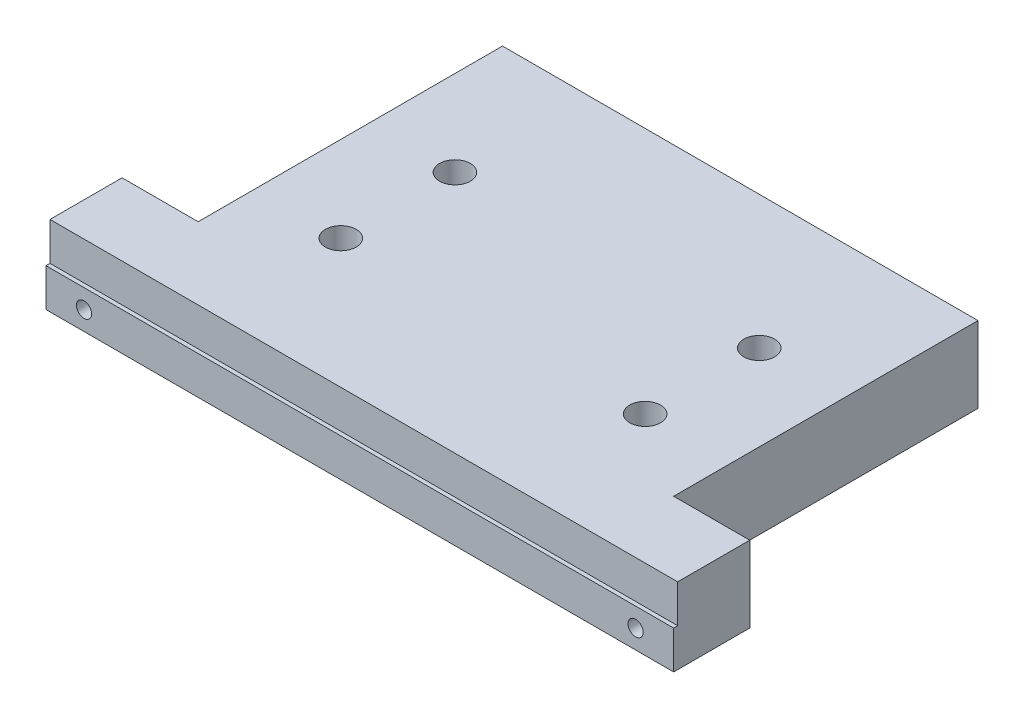
ISO-10303-21;
HEADER;
FILE_DESCRIPTION(('STEP AP214'),'2;1');
FILE_NAME('part.step','',(''),(''),'','','');
FILE_SCHEMA(('AUTOMOTIVE_DESIGN { 1 0 10303 214 1 1 1 1 }'));
ENDSEC;
DATA;
#1=APPLICATION_CONTEXT('core data for automotive mechanical design processes');
#2=APPLICATION_PROTOCOL_DEFINITION('international standard','automotive_design',2000,#1);
#3=PRODUCT_CONTEXT('',#1,'mechanical');
#4=PRODUCT('Part','Part','',(#3));
#5=PRODUCT_RELATED_PRODUCT_CATEGORY('part','',(#4));
#6=PRODUCT_DEFINITION_FORMATION('','',#4);
#7=PRODUCT_DEFINITION_CONTEXT('part definition',#1,'design');
#8=PRODUCT_DEFINITION('design','',#6,#7);
#9=PRODUCT_DEFINITION_SHAPE('','',#8);
#10=(LENGTH_UNIT() NAMED_UNIT(*) SI_UNIT(.MILLI.,.METRE.));
#11=(NAMED_UNIT(*) PLANE_ANGLE_UNIT() SI_UNIT($,.RADIAN.));
#12=(NAMED_UNIT(*) SI_UNIT($,.STERADIAN.) SOLID_ANGLE_UNIT());
#13=UNCERTAINTY_MEASURE_WITH_UNIT(LENGTH_MEASURE(1.E-05),#10,'distance_accuracy_value','');
#14=(GEOMETRIC_REPRESENTATION_CONTEXT(3) GLOBAL_UNCERTAINTY_ASSIGNED_CONTEXT((#13)) GLOBAL_UNIT_ASSIGNED_CONTEXT((#10,
#11,#12)) REPRESENTATION_CONTEXT('',''));
#15=CARTESIAN_POINT('',(0.,0.,0.));
#16=DIRECTION('',(0.,0.,1.));
#17=DIRECTION('',(1.,0.,0.));
#18=AXIS2_PLACEMENT_3D('',#15,#16,#17);
#19=CARTESIAN_POINT('',(125.,0.,100.));
#20=DIRECTION('',(-1.,0.,0.));
#21=DIRECTION('',(0.,0.,1.));
#22=AXIS2_PLACEMENT_3D('',#19,#20,#21);
#23=PLANE('',#22);
#24=DIRECTION('',(0.,1.,0.));
#25=VECTOR('',#24,1.);
#26=CARTESIAN_POINT('',(125.,20.,80.));
#27=LINE('',#26,#25);
#28=CARTESIAN_POINT('',(125.,0.,80.));
#29=VERTEX_POINT('',#28);
#30=CARTESIAN_POINT('',(125.,20.,80.));
#31=VERTEX_POINT('',#30);
#32=EDGE_CURVE('E60',#29,#31,#27,.T.);
#33=ORIENTED_EDGE('',*,*,#32,.F.);
#34=DIRECTION('',(0.,0.,-1.));
#35=VECTOR('',#34,1.);
#36=CARTESIAN_POINT('',(125.,0.,100.));
#37=LINE('',#36,#35);
#38=CARTESIAN_POINT('',(125.,0.,0.));
#39=VERTEX_POINT('',#38);
#40=EDGE_CURVE('E45',#29,#39,#37,.T.);
#41=ORIENTED_EDGE('',*,*,#40,.T.);
#42=DIRECTION('',(0.,1.,0.));
#43=VECTOR('',#42,1.);
#44=CARTESIAN_POINT('',(125.,0.,0.));
#45=LINE('',#44,#43);
#46=CARTESIAN_POINT('',(125.,20.,0.));
#47=VERTEX_POINT('',#46);
#48=EDGE_CURVE('E161',#39,#47,#45,.T.);
#49=ORIENTED_EDGE('',*,*,#48,.T.);
#50=DIRECTION('',(0.,0.,-1.));
#51=VECTOR('',#50,1.);
#52=CARTESIAN_POINT('',(125.,20.,100.));
#53=LINE('',#52,#51);
#54=EDGE_CURVE('E167',#31,#47,#53,.T.);
#55=ORIENTED_EDGE('',*,*,#54,.F.);
#56=EDGE_LOOP('',(#33,#41,#49,#55));
#57=FACE_BOUND('',#56,.T.);
#58=ADVANCED_FACE('F37',(#57),#23,.F.);
#59=CARTESIAN_POINT('',(0.,0.,100.));
#60=DIRECTION('',(1.,0.,0.));
#61=DIRECTION('',(0.,1.,0.));
#62=AXIS2_PLACEMENT_3D('',#59,#60,#61);
#63=PLANE('',#62);
#64=DIRECTION('',(0.,-1.,0.));
#65=VECTOR('',#64,1.);
#66=CARTESIAN_POINT('',(0.,20.,80.));
#67=LINE('',#66,#65);
#68=CARTESIAN_POINT('',(0.,20.,80.));
#69=VERTEX_POINT('',#68);
#70=CARTESIAN_POINT('',(0.,0.,80.));
#71=VERTEX_POINT('',#70);
#72=EDGE_CURVE('E142',#69,#71,#67,.T.);
#73=ORIENTED_EDGE('',*,*,#72,.F.);
#74=DIRECTION('',(0.,0.,-1.));
#75=VECTOR('',#74,1.);
#76=CARTESIAN_POINT('',(0.,20.,100.));
#77=LINE('',#76,#75);
#78=CARTESIAN_POINT('',(0.,20.,0.));
#79=VERTEX_POINT('',#78);
#80=EDGE_CURVE('E154',#69,#79,#77,.T.);
#81=ORIENTED_EDGE('',*,*,#80,.T.);
#82=DIRECTION('',(0.,-1.,0.));
#83=VECTOR('',#82,1.);
#84=CARTESIAN_POINT('',(0.,0.,0.));
#85=LINE('',#84,#83);
#86=CARTESIAN_POINT('',(0.,0.,0.));
#87=VERTEX_POINT('',#86);
#88=EDGE_CURVE('E151',#79,#87,#85,.T.);
#89=ORIENTED_EDGE('',*,*,#88,.T.);
#90=DIRECTION('',(0.,0.,-1.));
#91=VECTOR('',#90,1.);
#92=CARTESIAN_POINT('',(0.,0.,100.));
#93=LINE('',#92,#91);
#94=EDGE_CURVE('E11',#71,#87,#93,.T.);
#95=ORIENTED_EDGE('',*,*,#94,.F.);
#96=EDGE_LOOP('',(#73,#81,#89,#95));
#97=FACE_BOUND('',#96,.T.);
#98=ADVANCED_FACE('F39',(#97),#63,.F.);
#99=CARTESIAN_POINT('',(0.,0.,100.));
#100=DIRECTION('',(0.,1.,0.));
#101=DIRECTION('',(0.,0.,1.));
#102=AXIS2_PLACEMENT_3D('',#99,#100,#101);
#103=PLANE('',#102);
#104=CARTESIAN_POINT('',(102.5,0.,35.0000000000001));
#105=DIRECTION('',(0.,1.,0.));
#106=DIRECTION('',(0.,0.,1.));
#107=AXIS2_PLACEMENT_3D('',#104,#105,#106);
#108=CIRCLE('',#107,4.05);
#109=CARTESIAN_POINT('',(102.5,0.,39.0500000000001));
#110=VERTEX_POINT('',#109);
#111=EDGE_CURVE('E145',#110,#110,#108,.T.);
#112=ORIENTED_EDGE('',*,*,#111,.T.);
#113=EDGE_LOOP('',(#112));
#114=FACE_BOUND('',#113,.T.);
#115=CARTESIAN_POINT('',(102.5,0.,65.));
#116=DIRECTION('',(0.,1.,0.));
#117=DIRECTION('',(0.,0.,1.));
#118=AXIS2_PLACEMENT_3D('',#115,#116,#117);
#119=CIRCLE('',#118,4.05);
#120=CARTESIAN_POINT('',(102.5,0.,69.05));
#121=VERTEX_POINT('',#120);
#122=EDGE_CURVE('E222',#121,#121,#119,.T.);
#123=ORIENTED_EDGE('',*,*,#122,.T.);
#124=EDGE_LOOP('',(#123));
#125=FACE_BOUND('',#124,.T.);
#126=CARTESIAN_POINT('',(22.5,0.,65.));
#127=DIRECTION('',(0.,1.,0.));
#128=DIRECTION('',(0.,0.,1.));
#129=AXIS2_PLACEMENT_3D('',#126,#127,#128);
#130=CIRCLE('',#129,4.05);
#131=CARTESIAN_POINT('',(22.5,0.,69.05));
#132=VERTEX_POINT('',#131);
#133=EDGE_CURVE('E219',#132,#132,#130,.T.);
#134=ORIENTED_EDGE('',*,*,#133,.T.);
#135=EDGE_LOOP('',(#134));
#136=FACE_BOUND('',#135,.T.);
#137=CARTESIAN_POINT('',(22.5,0.,35.));
#138=DIRECTION('',(0.,1.,0.));
#139=DIRECTION('',(0.,0.,1.));
#140=AXIS2_PLACEMENT_3D('',#137,#138,#139);
#141=CIRCLE('',#140,4.05);
#142=CARTESIAN_POINT('',(22.5,0.,39.05));
#143=VERTEX_POINT('',#142);
#144=EDGE_CURVE('E216',#143,#143,#141,.T.);
#145=ORIENTED_EDGE('',*,*,#144,.T.);
#146=EDGE_LOOP('',(#145));
#147=FACE_BOUND('',#146,.T.);
#148=DIRECTION('',(1.,0.,0.));
#149=VECTOR('',#148,1.);
#150=CARTESIAN_POINT('',(0.,0.,0.));
#151=LINE('',#150,#149);
#152=EDGE_CURVE('E158',#87,#39,#151,.T.);
#153=ORIENTED_EDGE('',*,*,#152,.T.);
#154=ORIENTED_EDGE('',*,*,#40,.F.);
#155=DIRECTION('',(-1.,0.,0.));
#156=VECTOR('',#155,1.);
#157=CARTESIAN_POINT('',(145.,0.,80.));
#158=LINE('',#157,#156);
#159=CARTESIAN_POINT('',(145.,0.,80.));
#160=VERTEX_POINT('',#159);
#161=EDGE_CURVE('E190',#160,#29,#158,.T.);
#162=ORIENTED_EDGE('',*,*,#161,.F.);
#163=DIRECTION('',(0.,0.,-1.));
#164=VECTOR('',#163,1.);
#165=CARTESIAN_POINT('',(145.,0.,100.));
#166=LINE('',#165,#164);
#167=CARTESIAN_POINT('',(145.,0.,100.));
#168=VERTEX_POINT('',#167);
#169=EDGE_CURVE('E193',#168,#160,#166,.T.);
#170=ORIENTED_EDGE('',*,*,#169,.F.);
#171=DIRECTION('',(1.,0.,0.));
#172=VECTOR('',#171,1.);
#173=CARTESIAN_POINT('',(0.,0.,100.));
#174=LINE('',#173,#172);
#175=CARTESIAN_POINT('',(-20.,0.,100.));
#176=VERTEX_POINT('',#175);
#177=EDGE_CURVE('E152',#176,#168,#174,.T.);
#178=ORIENTED_EDGE('',*,*,#177,.F.);
#179=DIRECTION('',(0.,0.,1.));
#180=VECTOR('',#179,1.);
#181=CARTESIAN_POINT('',(-20.,0.,80.));
#182=LINE('',#181,#180);
#183=CARTESIAN_POINT('',(-20.,0.,80.));
#184=VERTEX_POINT('',#183);
#185=EDGE_CURVE('E133',#184,#176,#182,.T.);
#186=ORIENTED_EDGE('',*,*,#185,.F.);
#187=DIRECTION('',(1.,0.,0.));
#188=VECTOR('',#187,1.);
#189=CARTESIAN_POINT('',(-20.,0.,80.));
#190=LINE('',#189,#188);
#191=EDGE_CURVE('E148',#184,#71,#190,.T.);
#192=ORIENTED_EDGE('',*,*,#191,.T.);
#193=ORIENTED_EDGE('',*,*,#94,.T.);
#194=EDGE_LOOP('',(#153,#154,#162,#170,#178,#186,#192,#193));
#195=FACE_BOUND('',#194,.T.);
#196=ADVANCED_FACE('F174',(#114,#125,#136,#147,#195),#103,.F.);
#197=CARTESIAN_POINT('',(0.,20.,100.));
#198=DIRECTION('',(0.,-1.,0.));
#199=DIRECTION('',(0.,0.,-1.));
#200=AXIS2_PLACEMENT_3D('',#197,#198,#199);
#201=PLANE('',#200);
#202=CARTESIAN_POINT('',(102.5,20.,35.0000000000001));
#203=DIRECTION('',(0.,1.,0.));
#204=DIRECTION('',(0.,0.,-1.));
#205=AXIS2_PLACEMENT_3D('',#202,#203,#204);
#206=CIRCLE('',#205,4.05);
#207=CARTESIAN_POINT('',(102.5,20.,30.9500000000001));
#208=VERTEX_POINT('',#207);
#209=EDGE_CURVE('E204',#208,#208,#206,.T.);
#210=ORIENTED_EDGE('',*,*,#209,.F.);
#211=EDGE_LOOP('',(#210));
#212=FACE_BOUND('',#211,.T.);
#213=CARTESIAN_POINT('',(102.5,20.,65.));
#214=DIRECTION('',(0.,1.,0.));
#215=DIRECTION('',(0.,0.,-1.));
#216=AXIS2_PLACEMENT_3D('',#213,#214,#215);
#217=CIRCLE('',#216,4.05);
#218=CARTESIAN_POINT('',(102.5,20.,60.95));
#219=VERTEX_POINT('',#218);
#220=EDGE_CURVE('E209',#219,#219,#217,.T.);
#221=ORIENTED_EDGE('',*,*,#220,.F.);
#222=EDGE_LOOP('',(#221));
#223=FACE_BOUND('',#222,.T.);
#224=CARTESIAN_POINT('',(22.5,20.,65.));
#225=DIRECTION('',(0.,1.,0.));
#226=DIRECTION('',(0.,0.,1.));
#227=AXIS2_PLACEMENT_3D('',#224,#225,#226);
#228=CIRCLE('',#227,4.05);
#229=CARTESIAN_POINT('',(22.5,20.,69.05));
#230=VERTEX_POINT('',#229);
#231=EDGE_CURVE('E205',#230,#230,#228,.T.);
#232=ORIENTED_EDGE('',*,*,#231,.F.);
#233=EDGE_LOOP('',(#232));
#234=FACE_BOUND('',#233,.T.);
#235=CARTESIAN_POINT('',(22.5,20.,35.));
#236=DIRECTION('',(0.,1.,0.));
#237=DIRECTION('',(0.,0.,1.));
#238=AXIS2_PLACEMENT_3D('',#235,#236,#237);
#239=CIRCLE('',#238,4.05);
#240=CARTESIAN_POINT('',(22.5,20.,39.05));
#241=VERTEX_POINT('',#240);
#242=EDGE_CURVE('E208',#241,#241,#239,.T.);
#243=ORIENTED_EDGE('',*,*,#242,.F.);
#244=EDGE_LOOP('',(#243));
#245=FACE_BOUND('',#244,.T.);
#246=DIRECTION('',(0.,0.,-1.));
#247=VECTOR('',#246,1.);
#248=CARTESIAN_POINT('',(-20.,20.,80.));
#249=LINE('',#248,#247);
#250=CARTESIAN_POINT('',(-20.,20.,98.95));
#251=VERTEX_POINT('',#250);
#252=CARTESIAN_POINT('',(-20.,20.,80.));
#253=VERTEX_POINT('',#252);
#254=EDGE_CURVE('E134',#251,#253,#249,.T.);
#255=ORIENTED_EDGE('',*,*,#254,.F.);
#256=DIRECTION('',(-1.,0.,0.));
#257=VECTOR('',#256,1.);
#258=CARTESIAN_POINT('',(-20.,20.,98.95));
#259=LINE('',#258,#257);
#260=CARTESIAN_POINT('',(145.,20.,98.95));
#261=VERTEX_POINT('',#260);
#262=EDGE_CURVE('E119',#261,#251,#259,.T.);
#263=ORIENTED_EDGE('',*,*,#262,.F.);
#264=DIRECTION('',(0.,0.,1.));
#265=VECTOR('',#264,1.);
#266=CARTESIAN_POINT('',(145.,20.,100.));
#267=LINE('',#266,#265);
#268=CARTESIAN_POINT('',(145.,20.,80.));
#269=VERTEX_POINT('',#268);
#270=EDGE_CURVE('E200',#269,#261,#267,.T.);
#271=ORIENTED_EDGE('',*,*,#270,.F.);
#272=DIRECTION('',(-1.,0.,0.));
#273=VECTOR('',#272,1.);
#274=CARTESIAN_POINT('',(145.,20.,80.));
#275=LINE('',#274,#273);
#276=EDGE_CURVE('E186',#269,#31,#275,.T.);
#277=ORIENTED_EDGE('',*,*,#276,.T.);
#278=ORIENTED_EDGE('',*,*,#54,.T.);
#279=DIRECTION('',(-1.,0.,0.));
#280=VECTOR('',#279,1.);
#281=CARTESIAN_POINT('',(0.,20.,0.));
#282=LINE('',#281,#280);
#283=EDGE_CURVE('E155',#47,#79,#282,.T.);
#284=ORIENTED_EDGE('',*,*,#283,.T.);
#285=ORIENTED_EDGE('',*,*,#80,.F.);
#286=DIRECTION('',(1.,0.,0.));
#287=VECTOR('',#286,1.);
#288=CARTESIAN_POINT('',(-20.,20.,80.));
#289=LINE('',#288,#287);
#290=EDGE_CURVE('E136',#253,#69,#289,.T.);
#291=ORIENTED_EDGE('',*,*,#290,.F.);
#292=EDGE_LOOP('',(#255,#263,#271,#277,#278,#284,#285,#291));
#293=FACE_BOUND('',#292,.T.);
#294=ADVANCED_FACE('F181',(#212,#223,#234,#245,#293),#201,.F.);
#295=CARTESIAN_POINT('',(0.,0.,100.));
#296=DIRECTION('',(0.,0.,-1.));
#297=DIRECTION('',(-1.,0.,0.));
#298=AXIS2_PLACEMENT_3D('',#295,#296,#297);
#299=PLANE('',#298);
#300=CARTESIAN_POINT('',(-10.,4.99999999999983,100.));
#301=DIRECTION('',(0.,0.,-1.));
#302=DIRECTION('',(-1.,0.,0.));
#303=AXIS2_PLACEMENT_3D('',#300,#301,#302);
#304=CIRCLE('',#303,2.);
#305=CARTESIAN_POINT('',(-12.,4.99999999999983,100.));
#306=VERTEX_POINT('',#305);
#307=EDGE_CURVE('E191',#306,#306,#304,.T.);
#308=ORIENTED_EDGE('',*,*,#307,.T.);
#309=EDGE_LOOP('',(#308));
#310=FACE_BOUND('',#309,.T.);
#311=CARTESIAN_POINT('',(135.,4.99999999999981,100.));
#312=DIRECTION('',(0.,0.,-1.));
#313=DIRECTION('',(1.,0.,0.));
#314=AXIS2_PLACEMENT_3D('',#311,#312,#313);
#315=CIRCLE('',#314,2.00000000000003);
#316=CARTESIAN_POINT('',(137.,4.99999999999981,100.));
#317=VERTEX_POINT('',#316);
#318=EDGE_CURVE('E235',#317,#317,#315,.T.);
#319=ORIENTED_EDGE('',*,*,#318,.T.);
#320=EDGE_LOOP('',(#319));
#321=FACE_BOUND('',#320,.T.);
#322=DIRECTION('',(0.,-1.,0.));
#323=VECTOR('',#322,1.);
#324=CARTESIAN_POINT('',(145.,20.,100.));
#325=LINE('',#324,#323);
#326=CARTESIAN_POINT('',(145.,10.,100.));
#327=VERTEX_POINT('',#326);
#328=EDGE_CURVE('E127',#327,#168,#325,.T.);
#329=ORIENTED_EDGE('',*,*,#328,.F.);
#330=DIRECTION('',(1.,0.,0.));
#331=VECTOR('',#330,1.);
#332=CARTESIAN_POINT('',(-20.,10.,100.));
#333=LINE('',#332,#331);
#334=CARTESIAN_POINT('',(-20.,10.,100.));
#335=VERTEX_POINT('',#334);
#336=EDGE_CURVE('E52',#335,#327,#333,.T.);
#337=ORIENTED_EDGE('',*,*,#336,.F.);
#338=DIRECTION('',(0.,1.,0.));
#339=VECTOR('',#338,1.);
#340=CARTESIAN_POINT('',(-20.,20.,100.));
#341=LINE('',#340,#339);
#342=EDGE_CURVE('E126',#176,#335,#341,.T.);
#343=ORIENTED_EDGE('',*,*,#342,.F.);
#344=ORIENTED_EDGE('',*,*,#177,.T.);
#345=EDGE_LOOP('',(#329,#337,#343,#344));
#346=FACE_BOUND('',#345,.T.);
#347=ADVANCED_FACE('F124',(#310,#321,#346),#299,.F.);
#348=CARTESIAN_POINT('',(0.,0.,0.));
#349=DIRECTION('',(0.,0.,-1.));
#350=DIRECTION('',(-1.,0.,0.));
#351=AXIS2_PLACEMENT_3D('',#348,#349,#350);
#352=PLANE('',#351);
#353=ORIENTED_EDGE('',*,*,#88,.F.);
#354=ORIENTED_EDGE('',*,*,#283,.F.);
#355=ORIENTED_EDGE('',*,*,#48,.F.);
#356=ORIENTED_EDGE('',*,*,#152,.F.);
#357=EDGE_LOOP('',(#353,#354,#355,#356));
#358=FACE_BOUND('',#357,.T.);
#359=ADVANCED_FACE('F177',(#358),#352,.T.);
#360=CARTESIAN_POINT('',(-20.,20.,80.));
#361=DIRECTION('',(0.,0.,1.));
#362=DIRECTION('',(0.,-1.,0.));
#363=AXIS2_PLACEMENT_3D('',#360,#361,#362);
#364=PLANE('',#363);
#365=CARTESIAN_POINT('',(-10.,4.99999999999983,80.));
#366=DIRECTION('',(0.,0.,-1.));
#367=DIRECTION('',(-1.,0.,0.));
#368=AXIS2_PLACEMENT_3D('',#365,#366,#367);
#369=CIRCLE('',#368,2.);
#370=CARTESIAN_POINT('',(-12.,4.99999999999983,80.));
#371=VERTEX_POINT('',#370);
#372=EDGE_CURVE('E196',#371,#371,#369,.T.);
#373=ORIENTED_EDGE('',*,*,#372,.F.);
#374=EDGE_LOOP('',(#373));
#375=FACE_BOUND('',#374,.T.);
#376=ORIENTED_EDGE('',*,*,#72,.T.);
#377=ORIENTED_EDGE('',*,*,#191,.F.);
#378=DIRECTION('',(0.,-1.,0.));
#379=VECTOR('',#378,1.);
#380=CARTESIAN_POINT('',(-20.,20.,80.));
#381=LINE('',#380,#379);
#382=EDGE_CURVE('E138',#253,#184,#381,.T.);
#383=ORIENTED_EDGE('',*,*,#382,.F.);
#384=ORIENTED_EDGE('',*,*,#290,.T.);
#385=EDGE_LOOP('',(#376,#377,#383,#384));
#386=FACE_BOUND('',#385,.T.);
#387=ADVANCED_FACE('F229',(#375,#386),#364,.F.);
#388=CARTESIAN_POINT('',(-20.,0.,0.));
#389=DIRECTION('',(-1.,0.,0.));
#390=DIRECTION('',(0.,-1.,0.));
#391=AXIS2_PLACEMENT_3D('',#388,#389,#390);
#392=PLANE('',#391);
#393=DIRECTION('',(0.,1.,0.));
#394=VECTOR('',#393,1.);
#395=CARTESIAN_POINT('',(-20.,10.,98.95));
#396=LINE('',#395,#394);
#397=CARTESIAN_POINT('',(-20.,10.,98.95));
#398=VERTEX_POINT('',#397);
#399=EDGE_CURVE('E239',#398,#251,#396,.T.);
#400=ORIENTED_EDGE('',*,*,#399,.T.);
#401=ORIENTED_EDGE('',*,*,#254,.T.);
#402=ORIENTED_EDGE('',*,*,#382,.T.);
#403=ORIENTED_EDGE('',*,*,#185,.T.);
#404=ORIENTED_EDGE('',*,*,#342,.T.);
#405=DIRECTION('',(0.,0.,1.));
#406=VECTOR('',#405,1.);
#407=CARTESIAN_POINT('',(-20.,10.,100.));
#408=LINE('',#407,#406);
#409=EDGE_CURVE('E112',#398,#335,#408,.T.);
#410=ORIENTED_EDGE('',*,*,#409,.F.);
#411=EDGE_LOOP('',(#400,#401,#402,#403,#404,#410));
#412=FACE_BOUND('',#411,.T.);
#413=ADVANCED_FACE('F131',(#412),#392,.T.);
#414=CARTESIAN_POINT('',(22.5,-20.,35.));
#415=DIRECTION('',(0.,1.,0.));
#416=DIRECTION('',(0.,0.,1.));
#417=AXIS2_PLACEMENT_3D('',#414,#415,#416);
#418=CYLINDRICAL_SURFACE('',#417,4.05);
#419=ORIENTED_EDGE('',*,*,#242,.T.);
#420=EDGE_LOOP('',(#419));
#421=FACE_BOUND('',#420,.T.);
#422=ORIENTED_EDGE('',*,*,#144,.F.);
#423=EDGE_LOOP('',(#422));
#424=FACE_BOUND('',#423,.T.);
#425=ADVANCED_FACE('F290',(#421,#424),#418,.F.);
#426=CARTESIAN_POINT('',(22.5,-20.,65.));
#427=DIRECTION('',(0.,1.,0.));
#428=DIRECTION('',(0.,0.,1.));
#429=AXIS2_PLACEMENT_3D('',#426,#427,#428);
#430=CYLINDRICAL_SURFACE('',#429,4.05);
#431=ORIENTED_EDGE('',*,*,#231,.T.);
#432=EDGE_LOOP('',(#431));
#433=FACE_BOUND('',#432,.T.);
#434=ORIENTED_EDGE('',*,*,#133,.F.);
#435=EDGE_LOOP('',(#434));
#436=FACE_BOUND('',#435,.T.);
#437=ADVANCED_FACE('F292',(#433,#436),#430,.F.);
#438=CARTESIAN_POINT('',(102.5,-20.,65.));
#439=DIRECTION('',(0.,1.,0.));
#440=DIRECTION('',(0.,0.,1.));
#441=AXIS2_PLACEMENT_3D('',#438,#439,#440);
#442=CYLINDRICAL_SURFACE('',#441,4.05);
#443=ORIENTED_EDGE('',*,*,#220,.T.);
#444=EDGE_LOOP('',(#443));
#445=FACE_BOUND('',#444,.T.);
#446=ORIENTED_EDGE('',*,*,#122,.F.);
#447=EDGE_LOOP('',(#446));
#448=FACE_BOUND('',#447,.T.);
#449=ADVANCED_FACE('F299',(#445,#448),#442,.F.);
#450=CARTESIAN_POINT('',(102.5,-20.,35.0000000000001));
#451=DIRECTION('',(0.,1.,0.));
#452=DIRECTION('',(0.,0.,1.));
#453=AXIS2_PLACEMENT_3D('',#450,#451,#452);
#454=CYLINDRICAL_SURFACE('',#453,4.05);
#455=ORIENTED_EDGE('',*,*,#209,.T.);
#456=EDGE_LOOP('',(#455));
#457=FACE_BOUND('',#456,.T.);
#458=ORIENTED_EDGE('',*,*,#111,.F.);
#459=EDGE_LOOP('',(#458));
#460=FACE_BOUND('',#459,.T.);
#461=ADVANCED_FACE('F265',(#457,#460),#454,.F.);
#462=CARTESIAN_POINT('',(145.,20.,80.));
#463=DIRECTION('',(0.,0.,1.));
#464=DIRECTION('',(1.,0.,0.));
#465=AXIS2_PLACEMENT_3D('',#462,#463,#464);
#466=PLANE('',#465);
#467=CARTESIAN_POINT('',(135.,4.99999999999981,80.));
#468=DIRECTION('',(0.,0.,-1.));
#469=DIRECTION('',(1.,0.,0.));
#470=AXIS2_PLACEMENT_3D('',#467,#468,#469);
#471=CIRCLE('',#470,2.00000000000003);
#472=CARTESIAN_POINT('',(137.,4.99999999999981,80.));
#473=VERTEX_POINT('',#472);
#474=EDGE_CURVE('E238',#473,#473,#471,.T.);
#475=ORIENTED_EDGE('',*,*,#474,.F.);
#476=EDGE_LOOP('',(#475));
#477=FACE_BOUND('',#476,.T.);
#478=ORIENTED_EDGE('',*,*,#32,.T.);
#479=ORIENTED_EDGE('',*,*,#276,.F.);
#480=DIRECTION('',(0.,1.,0.));
#481=VECTOR('',#480,1.);
#482=CARTESIAN_POINT('',(145.,20.,80.));
#483=LINE('',#482,#481);
#484=EDGE_CURVE('E232',#160,#269,#483,.T.);
#485=ORIENTED_EDGE('',*,*,#484,.F.);
#486=ORIENTED_EDGE('',*,*,#161,.T.);
#487=EDGE_LOOP('',(#478,#479,#485,#486));
#488=FACE_BOUND('',#487,.T.);
#489=ADVANCED_FACE('F188',(#477,#488),#466,.F.);
#490=CARTESIAN_POINT('',(145.,0.,0.));
#491=DIRECTION('',(1.,0.,0.));
#492=DIRECTION('',(0.,0.,-1.));
#493=AXIS2_PLACEMENT_3D('',#490,#491,#492);
#494=PLANE('',#493);
#495=DIRECTION('',(0.,1.,0.));
#496=VECTOR('',#495,1.);
#497=CARTESIAN_POINT('',(145.,10.,98.95));
#498=LINE('',#497,#496);
#499=CARTESIAN_POINT('',(145.,10.,98.95));
#500=VERTEX_POINT('',#499);
#501=EDGE_CURVE('E244',#500,#261,#498,.T.);
#502=ORIENTED_EDGE('',*,*,#501,.F.);
#503=DIRECTION('',(0.,0.,-1.));
#504=VECTOR('',#503,1.);
#505=CARTESIAN_POINT('',(145.,10.,100.));
#506=LINE('',#505,#504);
#507=EDGE_CURVE('E128',#327,#500,#506,.T.);
#508=ORIENTED_EDGE('',*,*,#507,.F.);
#509=ORIENTED_EDGE('',*,*,#328,.T.);
#510=ORIENTED_EDGE('',*,*,#169,.T.);
#511=ORIENTED_EDGE('',*,*,#484,.T.);
#512=ORIENTED_EDGE('',*,*,#270,.T.);
#513=EDGE_LOOP('',(#502,#508,#509,#510,#511,#512));
#514=FACE_BOUND('',#513,.T.);
#515=ADVANCED_FACE('F254',(#514),#494,.T.);
#516=CARTESIAN_POINT('',(135.,4.99999999999981,100.));
#517=DIRECTION('',(0.,0.,-1.));
#518=DIRECTION('',(-1.,0.,0.));
#519=AXIS2_PLACEMENT_3D('',#516,#517,#518);
#520=CYLINDRICAL_SURFACE('',#519,2.00000000000003);
#521=ORIENTED_EDGE('',*,*,#318,.F.);
#522=EDGE_LOOP('',(#521));
#523=FACE_BOUND('',#522,.T.);
#524=ORIENTED_EDGE('',*,*,#474,.T.);
#525=EDGE_LOOP('',(#524));
#526=FACE_BOUND('',#525,.T.);
#527=ADVANCED_FACE('F256',(#523,#526),#520,.F.);
#528=CARTESIAN_POINT('',(-10.,4.99999999999983,100.));
#529=DIRECTION('',(0.,0.,-1.));
#530=DIRECTION('',(-1.,0.,0.));
#531=AXIS2_PLACEMENT_3D('',#528,#529,#530);
#532=CYLINDRICAL_SURFACE('',#531,2.);
#533=ORIENTED_EDGE('',*,*,#307,.F.);
#534=EDGE_LOOP('',(#533));
#535=FACE_BOUND('',#534,.T.);
#536=ORIENTED_EDGE('',*,*,#372,.T.);
#537=EDGE_LOOP('',(#536));
#538=FACE_BOUND('',#537,.T.);
#539=ADVANCED_FACE('F262',(#535,#538),#532,.F.);
#540=CARTESIAN_POINT('',(-20.,10.,98.95));
#541=DIRECTION('',(0.,0.,-1.));
#542=DIRECTION('',(-1.,0.,0.));
#543=AXIS2_PLACEMENT_3D('',#540,#541,#542);
#544=PLANE('',#543);
#545=ORIENTED_EDGE('',*,*,#262,.T.);
#546=ORIENTED_EDGE('',*,*,#399,.F.);
#547=DIRECTION('',(-1.,0.,0.));
#548=VECTOR('',#547,1.);
#549=CARTESIAN_POINT('',(-20.,10.,98.95));
#550=LINE('',#549,#548);
#551=EDGE_CURVE('E115',#500,#398,#550,.T.);
#552=ORIENTED_EDGE('',*,*,#551,.F.);
#553=ORIENTED_EDGE('',*,*,#501,.T.);
#554=EDGE_LOOP('',(#545,#546,#552,#553));
#555=FACE_BOUND('',#554,.T.);
#556=ADVANCED_FACE('F251',(#555),#544,.F.);
#557=CARTESIAN_POINT('',(0.,10.,0.));
#558=DIRECTION('',(0.,-1.,0.));
#559=DIRECTION('',(0.,0.,-1.));
#560=AXIS2_PLACEMENT_3D('',#557,#558,#559);
#561=PLANE('',#560);
#562=ORIENTED_EDGE('',*,*,#409,.T.);
#563=ORIENTED_EDGE('',*,*,#336,.T.);
#564=ORIENTED_EDGE('',*,*,#507,.T.);
#565=ORIENTED_EDGE('',*,*,#551,.T.);
#566=EDGE_LOOP('',(#562,#563,#564,#565));
#567=FACE_BOUND('',#566,.T.);
#568=ADVANCED_FACE('F113',(#567),#561,.F.);
#569=CLOSED_SHELL('',(#58,#98,#196,#294,#347,#359,#387,#413,#425,#437,#449,#461,#489,#515,#527,
#539,#556,#568));
#570=MANIFOLD_SOLID_BREP('B2',#569);
#571=ADVANCED_BREP_SHAPE_REPRESENTATION('',(#18,#570),#14);
#572=SHAPE_DEFINITION_REPRESENTATION(#9,#571);
ENDSEC;
END-ISO-10303-21;
